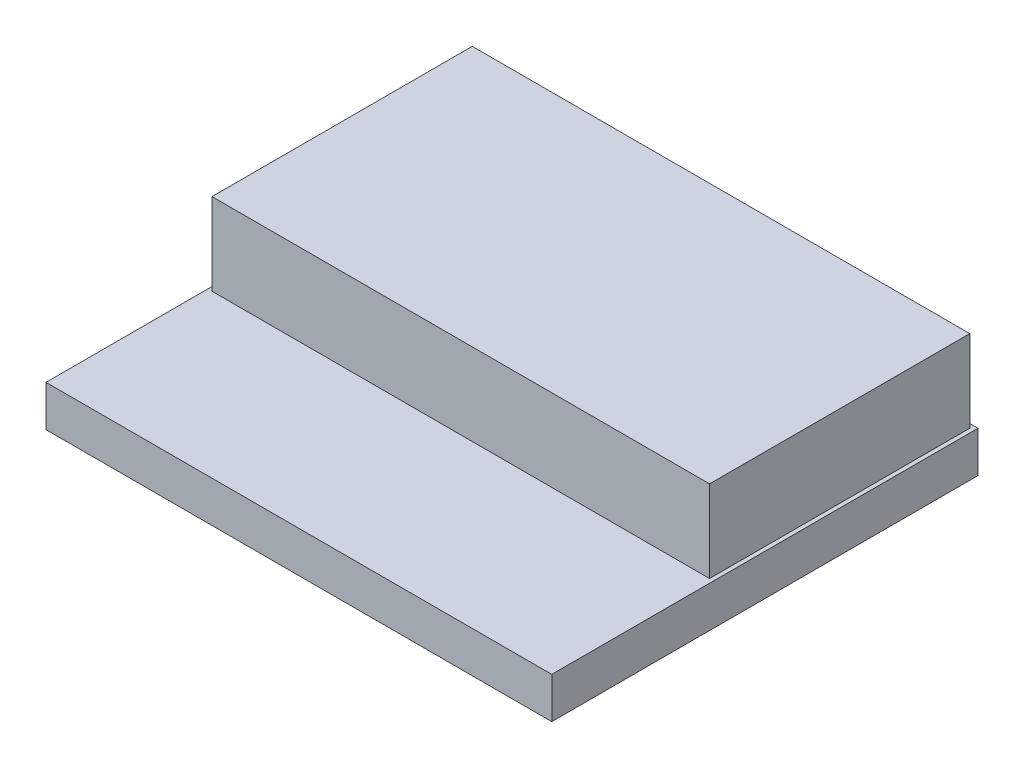
ISO-10303-21;
HEADER;
FILE_DESCRIPTION(('STEP AP214'),'2;1');
FILE_NAME('part.step','',(''),(''),'','','');
FILE_SCHEMA(('AUTOMOTIVE_DESIGN { 1 0 10303 214 1 1 1 1 }'));
ENDSEC;
DATA;
#1=APPLICATION_CONTEXT('core data for automotive mechanical design processes');
#2=APPLICATION_PROTOCOL_DEFINITION('international standard','automotive_design',2000,#1);
#3=PRODUCT_CONTEXT('',#1,'mechanical');
#4=PRODUCT('Part','Part','',(#3));
#5=PRODUCT_RELATED_PRODUCT_CATEGORY('part','',(#4));
#6=PRODUCT_DEFINITION_FORMATION('','',#4);
#7=PRODUCT_DEFINITION_CONTEXT('part definition',#1,'design');
#8=PRODUCT_DEFINITION('design','',#6,#7);
#9=PRODUCT_DEFINITION_SHAPE('','',#8);
#10=(LENGTH_UNIT() NAMED_UNIT(*) SI_UNIT(.MILLI.,.METRE.));
#11=(NAMED_UNIT(*) PLANE_ANGLE_UNIT() SI_UNIT($,.RADIAN.));
#12=(NAMED_UNIT(*) SI_UNIT($,.STERADIAN.) SOLID_ANGLE_UNIT());
#13=UNCERTAINTY_MEASURE_WITH_UNIT(LENGTH_MEASURE(1.E-05),#10,'distance_accuracy_value','');
#14=(GEOMETRIC_REPRESENTATION_CONTEXT(3) GLOBAL_UNCERTAINTY_ASSIGNED_CONTEXT((#13)) GLOBAL_UNIT_ASSIGNED_CONTEXT((#10,
#11,#12)) REPRESENTATION_CONTEXT('',''));
#15=CARTESIAN_POINT('',(0.,0.,0.));
#16=DIRECTION('',(0.,0.,1.));
#17=DIRECTION('',(1.,0.,0.));
#18=AXIS2_PLACEMENT_3D('',#15,#16,#17);
#19=CARTESIAN_POINT('',(0.,1.,0.));
#20=DIRECTION('',(0.,-1.,0.));
#21=DIRECTION('',(0.,0.,-1.));
#22=AXIS2_PLACEMENT_3D('',#19,#20,#21);
#23=PLANE('',#22);
#24=DIRECTION('',(0.,0.,-1.));
#25=VECTOR('',#24,1.);
#26=CARTESIAN_POINT('',(6.17,1.,5.2));
#27=LINE('',#26,#25);
#28=CARTESIAN_POINT('',(6.17,1.,5.2));
#29=VERTEX_POINT('',#28);
#30=CARTESIAN_POINT('',(6.17,1.,-5.2));
#31=VERTEX_POINT('',#30);
#32=EDGE_CURVE('E186',#29,#31,#27,.T.);
#33=ORIENTED_EDGE('',*,*,#32,.T.);
#34=DIRECTION('',(-1.,0.,0.));
#35=VECTOR('',#34,1.);
#36=CARTESIAN_POINT('',(-6.17,1.,-5.2));
#37=LINE('',#36,#35);
#38=CARTESIAN_POINT('',(-6.17,1.,-5.2));
#39=VERTEX_POINT('',#38);
#40=EDGE_CURVE('E189',#31,#39,#37,.T.);
#41=ORIENTED_EDGE('',*,*,#40,.T.);
#42=DIRECTION('',(0.,0.,1.));
#43=VECTOR('',#42,1.);
#44=CARTESIAN_POINT('',(-6.17,1.,5.2));
#45=LINE('',#44,#43);
#46=CARTESIAN_POINT('',(-6.17,1.,5.2));
#47=VERTEX_POINT('',#46);
#48=EDGE_CURVE('E192',#39,#47,#45,.T.);
#49=ORIENTED_EDGE('',*,*,#48,.T.);
#50=DIRECTION('',(1.,0.,0.));
#51=VECTOR('',#50,1.);
#52=CARTESIAN_POINT('',(-6.17,1.,5.2));
#53=LINE('',#52,#51);
#54=EDGE_CURVE('E194',#47,#29,#53,.T.);
#55=ORIENTED_EDGE('',*,*,#54,.T.);
#56=EDGE_LOOP('',(#33,#41,#49,#55));
#57=FACE_BOUND('',#56,.T.);
#58=DIRECTION('',(0.,0.,1.));
#59=VECTOR('',#58,1.);
#60=CARTESIAN_POINT('',(-6.07,1.,-5.1));
#61=LINE('',#60,#59);
#62=CARTESIAN_POINT('',(-6.07,1.,-5.1));
#63=VERTEX_POINT('',#62);
#64=CARTESIAN_POINT('',(-6.07,1.,1.25));
#65=VERTEX_POINT('',#64);
#66=EDGE_CURVE('E144',#63,#65,#61,.T.);
#67=ORIENTED_EDGE('',*,*,#66,.F.);
#68=DIRECTION('',(-1.,0.,0.));
#69=VECTOR('',#68,1.);
#70=CARTESIAN_POINT('',(6.07,1.,-5.1));
#71=LINE('',#70,#69);
#72=CARTESIAN_POINT('',(6.07,1.,-5.1));
#73=VERTEX_POINT('',#72);
#74=EDGE_CURVE('E169',#73,#63,#71,.T.);
#75=ORIENTED_EDGE('',*,*,#74,.F.);
#76=DIRECTION('',(0.,0.,-1.));
#77=VECTOR('',#76,1.);
#78=CARTESIAN_POINT('',(6.07,1.,1.25));
#79=LINE('',#78,#77);
#80=CARTESIAN_POINT('',(6.07,1.,1.25));
#81=VERTEX_POINT('',#80);
#82=EDGE_CURVE('E166',#81,#73,#79,.T.);
#83=ORIENTED_EDGE('',*,*,#82,.F.);
#84=DIRECTION('',(1.,0.,0.));
#85=VECTOR('',#84,1.);
#86=CARTESIAN_POINT('',(-6.07,1.,1.25));
#87=LINE('',#86,#85);
#88=EDGE_CURVE('E147',#65,#81,#87,.T.);
#89=ORIENTED_EDGE('',*,*,#88,.F.);
#90=EDGE_LOOP('',(#67,#75,#83,#89));
#91=FACE_BOUND('',#90,.T.);
#92=ADVANCED_FACE('F35',(#57,#91),#23,.F.);
#93=CARTESIAN_POINT('',(6.17,1.,5.2));
#94=DIRECTION('',(-1.,0.,0.));
#95=DIRECTION('',(0.,0.,1.));
#96=AXIS2_PLACEMENT_3D('',#93,#94,#95);
#97=PLANE('',#96);
#98=DIRECTION('',(0.,0.,-1.));
#99=VECTOR('',#98,1.);
#100=CARTESIAN_POINT('',(6.17,0.,5.2));
#101=LINE('',#100,#99);
#102=CARTESIAN_POINT('',(6.17,0.,5.2));
#103=VERTEX_POINT('',#102);
#104=CARTESIAN_POINT('',(6.17,0.,-5.2));
#105=VERTEX_POINT('',#104);
#106=EDGE_CURVE('E162',#103,#105,#101,.T.);
#107=ORIENTED_EDGE('',*,*,#106,.T.);
#108=DIRECTION('',(0.,-1.,0.));
#109=VECTOR('',#108,1.);
#110=CARTESIAN_POINT('',(6.17,1.,-5.2));
#111=LINE('',#110,#109);
#112=EDGE_CURVE('E12',#31,#105,#111,.T.);
#113=ORIENTED_EDGE('',*,*,#112,.F.);
#114=ORIENTED_EDGE('',*,*,#32,.F.);
#115=DIRECTION('',(0.,-1.,0.));
#116=VECTOR('',#115,1.);
#117=CARTESIAN_POINT('',(6.17,1.,5.2));
#118=LINE('',#117,#116);
#119=EDGE_CURVE('E196',#29,#103,#118,.T.);
#120=ORIENTED_EDGE('',*,*,#119,.T.);
#121=EDGE_LOOP('',(#107,#113,#114,#120));
#122=FACE_BOUND('',#121,.T.);
#123=ADVANCED_FACE('F37',(#122),#97,.F.);
#124=CARTESIAN_POINT('',(-6.17,1.,-5.2));
#125=DIRECTION('',(0.,0.,1.));
#126=DIRECTION('',(1.,0.,0.));
#127=AXIS2_PLACEMENT_3D('',#124,#125,#126);
#128=PLANE('',#127);
#129=DIRECTION('',(-1.,0.,0.));
#130=VECTOR('',#129,1.);
#131=CARTESIAN_POINT('',(-6.17,0.,-5.2));
#132=LINE('',#131,#130);
#133=CARTESIAN_POINT('',(-6.17,0.,-5.2));
#134=VERTEX_POINT('',#133);
#135=EDGE_CURVE('E199',#105,#134,#132,.T.);
#136=ORIENTED_EDGE('',*,*,#135,.T.);
#137=DIRECTION('',(0.,-1.,0.));
#138=VECTOR('',#137,1.);
#139=CARTESIAN_POINT('',(-6.17,1.,-5.2));
#140=LINE('',#139,#138);
#141=EDGE_CURVE('E43',#39,#134,#140,.T.);
#142=ORIENTED_EDGE('',*,*,#141,.F.);
#143=ORIENTED_EDGE('',*,*,#40,.F.);
#144=ORIENTED_EDGE('',*,*,#112,.T.);
#145=EDGE_LOOP('',(#136,#142,#143,#144));
#146=FACE_BOUND('',#145,.T.);
#147=ADVANCED_FACE('F229',(#146),#128,.F.);
#148=CARTESIAN_POINT('',(-6.17,1.,5.2));
#149=DIRECTION('',(1.,0.,0.));
#150=DIRECTION('',(0.,0.,-1.));
#151=AXIS2_PLACEMENT_3D('',#148,#149,#150);
#152=PLANE('',#151);
#153=DIRECTION('',(0.,0.,1.));
#154=VECTOR('',#153,1.);
#155=CARTESIAN_POINT('',(-6.17,0.,5.2));
#156=LINE('',#155,#154);
#157=CARTESIAN_POINT('',(-6.17,0.,5.2));
#158=VERTEX_POINT('',#157);
#159=EDGE_CURVE('E201',#134,#158,#156,.T.);
#160=ORIENTED_EDGE('',*,*,#159,.T.);
#161=DIRECTION('',(0.,-1.,0.));
#162=VECTOR('',#161,1.);
#163=CARTESIAN_POINT('',(-6.17,1.,5.2));
#164=LINE('',#163,#162);
#165=EDGE_CURVE('E206',#47,#158,#164,.T.);
#166=ORIENTED_EDGE('',*,*,#165,.F.);
#167=ORIENTED_EDGE('',*,*,#48,.F.);
#168=ORIENTED_EDGE('',*,*,#141,.T.);
#169=EDGE_LOOP('',(#160,#166,#167,#168));
#170=FACE_BOUND('',#169,.T.);
#171=ADVANCED_FACE('F213',(#170),#152,.F.);
#172=CARTESIAN_POINT('',(-6.17,1.,5.2));
#173=DIRECTION('',(0.,0.,-1.));
#174=DIRECTION('',(-1.,0.,0.));
#175=AXIS2_PLACEMENT_3D('',#172,#173,#174);
#176=PLANE('',#175);
#177=DIRECTION('',(1.,0.,0.));
#178=VECTOR('',#177,1.);
#179=CARTESIAN_POINT('',(-6.17,0.,5.2));
#180=LINE('',#179,#178);
#181=EDGE_CURVE('E190',#158,#103,#180,.T.);
#182=ORIENTED_EDGE('',*,*,#181,.T.);
#183=ORIENTED_EDGE('',*,*,#119,.F.);
#184=ORIENTED_EDGE('',*,*,#54,.F.);
#185=ORIENTED_EDGE('',*,*,#165,.T.);
#186=EDGE_LOOP('',(#182,#183,#184,#185));
#187=FACE_BOUND('',#186,.T.);
#188=ADVANCED_FACE('F222',(#187),#176,.F.);
#189=CARTESIAN_POINT('',(0.,0.,0.));
#190=DIRECTION('',(0.,-1.,0.));
#191=DIRECTION('',(0.,0.,-1.));
#192=AXIS2_PLACEMENT_3D('',#189,#190,#191);
#193=PLANE('',#192);
#194=DIRECTION('',(1.,0.,0.));
#195=VECTOR('',#194,1.);
#196=CARTESIAN_POINT('',(-2.3,0.,-1.33));
#197=LINE('',#196,#195);
#198=CARTESIAN_POINT('',(-2.3,0.,-1.33));
#199=VERTEX_POINT('',#198);
#200=CARTESIAN_POINT('',(2.3,0.,-1.33));
#201=VERTEX_POINT('',#200);
#202=EDGE_CURVE('E50',#199,#201,#197,.T.);
#203=ORIENTED_EDGE('',*,*,#202,.F.);
#204=DIRECTION('',(0.,0.,-1.));
#205=VECTOR('',#204,1.);
#206=CARTESIAN_POINT('',(-2.3,0.,1.33));
#207=LINE('',#206,#205);
#208=CARTESIAN_POINT('',(-2.3,0.,1.33));
#209=VERTEX_POINT('',#208);
#210=EDGE_CURVE('E54',#209,#199,#207,.T.);
#211=ORIENTED_EDGE('',*,*,#210,.F.);
#212=DIRECTION('',(-1.,0.,0.));
#213=VECTOR('',#212,1.);
#214=CARTESIAN_POINT('',(2.3,0.,1.33));
#215=LINE('',#214,#213);
#216=CARTESIAN_POINT('',(2.3,0.,1.33));
#217=VERTEX_POINT('',#216);
#218=EDGE_CURVE('E373',#217,#209,#215,.T.);
#219=ORIENTED_EDGE('',*,*,#218,.F.);
#220=DIRECTION('',(0.,0.,1.));
#221=VECTOR('',#220,1.);
#222=CARTESIAN_POINT('',(2.3,0.,-1.33));
#223=LINE('',#222,#221);
#224=EDGE_CURVE('E379',#201,#217,#223,.T.);
#225=ORIENTED_EDGE('',*,*,#224,.F.);
#226=EDGE_LOOP('',(#203,#211,#219,#225));
#227=FACE_BOUND('',#226,.T.);
#228=ORIENTED_EDGE('',*,*,#106,.F.);
#229=ORIENTED_EDGE('',*,*,#181,.F.);
#230=ORIENTED_EDGE('',*,*,#159,.F.);
#231=ORIENTED_EDGE('',*,*,#135,.F.);
#232=EDGE_LOOP('',(#228,#229,#230,#231));
#233=FACE_BOUND('',#232,.T.);
#234=ADVANCED_FACE('F219',(#227,#233),#193,.T.);
#235=CARTESIAN_POINT('',(6.07,19.7004415987223,-5.1));
#236=DIRECTION('',(0.,0.,1.));
#237=DIRECTION('',(1.,0.,0.));
#238=AXIS2_PLACEMENT_3D('',#235,#236,#237);
#239=PLANE('',#238);
#240=DIRECTION('',(0.,-1.,0.));
#241=VECTOR('',#240,1.);
#242=CARTESIAN_POINT('',(-6.07,19.7004415987223,-5.1));
#243=LINE('',#242,#241);
#244=CARTESIAN_POINT('',(-6.07,3.,-5.1));
#245=VERTEX_POINT('',#244);
#246=EDGE_CURVE('E172',#245,#63,#243,.T.);
#247=ORIENTED_EDGE('',*,*,#246,.F.);
#248=DIRECTION('',(1.,0.,0.));
#249=VECTOR('',#248,1.);
#250=CARTESIAN_POINT('',(6.07,3.,-5.1));
#251=LINE('',#250,#249);
#252=CARTESIAN_POINT('',(6.07,3.,-5.1));
#253=VERTEX_POINT('',#252);
#254=EDGE_CURVE('E157',#245,#253,#251,.T.);
#255=ORIENTED_EDGE('',*,*,#254,.T.);
#256=DIRECTION('',(0.,-1.,0.));
#257=VECTOR('',#256,1.);
#258=CARTESIAN_POINT('',(6.07,19.7004415987223,-5.1));
#259=LINE('',#258,#257);
#260=EDGE_CURVE('E175',#253,#73,#259,.T.);
#261=ORIENTED_EDGE('',*,*,#260,.T.);
#262=ORIENTED_EDGE('',*,*,#74,.T.);
#263=EDGE_LOOP('',(#247,#255,#261,#262));
#264=FACE_BOUND('',#263,.T.);
#265=ADVANCED_FACE('F246',(#264),#239,.F.);
#266=CARTESIAN_POINT('',(6.07,19.7004415987223,1.25));
#267=DIRECTION('',(-1.,0.,0.));
#268=DIRECTION('',(0.,0.,1.));
#269=AXIS2_PLACEMENT_3D('',#266,#267,#268);
#270=PLANE('',#269);
#271=ORIENTED_EDGE('',*,*,#260,.F.);
#272=DIRECTION('',(0.,0.,1.));
#273=VECTOR('',#272,1.);
#274=CARTESIAN_POINT('',(6.07,3.,1.25));
#275=LINE('',#274,#273);
#276=CARTESIAN_POINT('',(6.07,3.,1.25));
#277=VERTEX_POINT('',#276);
#278=EDGE_CURVE('E153',#253,#277,#275,.T.);
#279=ORIENTED_EDGE('',*,*,#278,.T.);
#280=DIRECTION('',(0.,-1.,0.));
#281=VECTOR('',#280,1.);
#282=CARTESIAN_POINT('',(6.07,19.7004415987223,1.25));
#283=LINE('',#282,#281);
#284=EDGE_CURVE('E178',#277,#81,#283,.T.);
#285=ORIENTED_EDGE('',*,*,#284,.T.);
#286=ORIENTED_EDGE('',*,*,#82,.T.);
#287=EDGE_LOOP('',(#271,#279,#285,#286));
#288=FACE_BOUND('',#287,.T.);
#289=ADVANCED_FACE('F264',(#288),#270,.F.);
#290=CARTESIAN_POINT('',(-6.07,19.7004415987223,1.25));
#291=DIRECTION('',(0.,0.,-1.));
#292=DIRECTION('',(-1.,0.,0.));
#293=AXIS2_PLACEMENT_3D('',#290,#291,#292);
#294=PLANE('',#293);
#295=ORIENTED_EDGE('',*,*,#284,.F.);
#296=DIRECTION('',(-1.,0.,0.));
#297=VECTOR('',#296,1.);
#298=CARTESIAN_POINT('',(-6.07,3.,1.25));
#299=LINE('',#298,#297);
#300=CARTESIAN_POINT('',(-6.07,3.,1.25));
#301=VERTEX_POINT('',#300);
#302=EDGE_CURVE('E156',#277,#301,#299,.T.);
#303=ORIENTED_EDGE('',*,*,#302,.T.);
#304=DIRECTION('',(0.,-1.,0.));
#305=VECTOR('',#304,1.);
#306=CARTESIAN_POINT('',(-6.07,19.7004415987223,1.25));
#307=LINE('',#306,#305);
#308=EDGE_CURVE('E181',#301,#65,#307,.T.);
#309=ORIENTED_EDGE('',*,*,#308,.T.);
#310=ORIENTED_EDGE('',*,*,#88,.T.);
#311=EDGE_LOOP('',(#295,#303,#309,#310));
#312=FACE_BOUND('',#311,.T.);
#313=ADVANCED_FACE('F272',(#312),#294,.F.);
#314=CARTESIAN_POINT('',(-6.07,19.7004415987223,-5.1));
#315=DIRECTION('',(1.,0.,0.));
#316=DIRECTION('',(0.,0.,-1.));
#317=AXIS2_PLACEMENT_3D('',#314,#315,#316);
#318=PLANE('',#317);
#319=ORIENTED_EDGE('',*,*,#308,.F.);
#320=DIRECTION('',(0.,0.,-1.));
#321=VECTOR('',#320,1.);
#322=CARTESIAN_POINT('',(-6.07,3.,-5.1));
#323=LINE('',#322,#321);
#324=EDGE_CURVE('E160',#301,#245,#323,.T.);
#325=ORIENTED_EDGE('',*,*,#324,.T.);
#326=ORIENTED_EDGE('',*,*,#246,.T.);
#327=ORIENTED_EDGE('',*,*,#66,.T.);
#328=EDGE_LOOP('',(#319,#325,#326,#327));
#329=FACE_BOUND('',#328,.T.);
#330=ADVANCED_FACE('F242',(#329),#318,.F.);
#331=CARTESIAN_POINT('',(0.,3.,0.));
#332=DIRECTION('',(0.,-1.,0.));
#333=DIRECTION('',(0.,0.,-1.));
#334=AXIS2_PLACEMENT_3D('',#331,#332,#333);
#335=PLANE('',#334);
#336=ORIENTED_EDGE('',*,*,#302,.F.);
#337=ORIENTED_EDGE('',*,*,#278,.F.);
#338=ORIENTED_EDGE('',*,*,#254,.F.);
#339=ORIENTED_EDGE('',*,*,#324,.F.);
#340=EDGE_LOOP('',(#336,#337,#338,#339));
#341=FACE_BOUND('',#340,.T.);
#342=ADVANCED_FACE('F286',(#341),#335,.F.);
#343=CARTESIAN_POINT('',(-2.3,-1.,-1.33));
#344=DIRECTION('',(0.,0.,1.));
#345=DIRECTION('',(1.,0.,0.));
#346=AXIS2_PLACEMENT_3D('',#343,#344,#345);
#347=PLANE('',#346);
#348=ORIENTED_EDGE('',*,*,#202,.T.);
#349=DIRECTION('',(0.,1.,0.));
#350=VECTOR('',#349,1.);
#351=CARTESIAN_POINT('',(2.3,-1.,-1.33));
#352=LINE('',#351,#350);
#353=CARTESIAN_POINT('',(2.3,-1.,-1.33));
#354=VERTEX_POINT('',#353);
#355=EDGE_CURVE('E127',#354,#201,#352,.T.);
#356=ORIENTED_EDGE('',*,*,#355,.F.);
#357=DIRECTION('',(1.,0.,0.));
#358=VECTOR('',#357,1.);
#359=CARTESIAN_POINT('',(-2.3,-1.,-1.33));
#360=LINE('',#359,#358);
#361=CARTESIAN_POINT('',(-2.3,-1.,-1.33));
#362=VERTEX_POINT('',#361);
#363=EDGE_CURVE('E133',#362,#354,#360,.T.);
#364=ORIENTED_EDGE('',*,*,#363,.F.);
#365=DIRECTION('',(0.,1.,0.));
#366=VECTOR('',#365,1.);
#367=CARTESIAN_POINT('',(-2.3,-1.,-1.33));
#368=LINE('',#367,#366);
#369=EDGE_CURVE('E371',#362,#199,#368,.T.);
#370=ORIENTED_EDGE('',*,*,#369,.T.);
#371=EDGE_LOOP('',(#348,#356,#364,#370));
#372=FACE_BOUND('',#371,.T.);
#373=ADVANCED_FACE('F143',(#372),#347,.F.);
#374=CARTESIAN_POINT('',(2.3,-1.,-1.33));
#375=DIRECTION('',(-1.,0.,0.));
#376=DIRECTION('',(0.,0.,1.));
#377=AXIS2_PLACEMENT_3D('',#374,#375,#376);
#378=PLANE('',#377);
#379=ORIENTED_EDGE('',*,*,#224,.T.);
#380=DIRECTION('',(0.,1.,0.));
#381=VECTOR('',#380,1.);
#382=CARTESIAN_POINT('',(2.3,-1.,1.33));
#383=LINE('',#382,#381);
#384=CARTESIAN_POINT('',(2.3,-1.,1.33));
#385=VERTEX_POINT('',#384);
#386=EDGE_CURVE('E129',#385,#217,#383,.T.);
#387=ORIENTED_EDGE('',*,*,#386,.F.);
#388=DIRECTION('',(0.,0.,1.));
#389=VECTOR('',#388,1.);
#390=CARTESIAN_POINT('',(2.3,-1.,-1.33));
#391=LINE('',#390,#389);
#392=EDGE_CURVE('E122',#354,#385,#391,.T.);
#393=ORIENTED_EDGE('',*,*,#392,.F.);
#394=ORIENTED_EDGE('',*,*,#355,.T.);
#395=EDGE_LOOP('',(#379,#387,#393,#394));
#396=FACE_BOUND('',#395,.T.);
#397=ADVANCED_FACE('F125',(#396),#378,.F.);
#398=CARTESIAN_POINT('',(2.3,-1.,1.33));
#399=DIRECTION('',(0.,0.,-1.));
#400=DIRECTION('',(-1.,0.,0.));
#401=AXIS2_PLACEMENT_3D('',#398,#399,#400);
#402=PLANE('',#401);
#403=ORIENTED_EDGE('',*,*,#218,.T.);
#404=DIRECTION('',(0.,1.,0.));
#405=VECTOR('',#404,1.);
#406=CARTESIAN_POINT('',(-2.3,-1.,1.33));
#407=LINE('',#406,#405);
#408=CARTESIAN_POINT('',(-2.3,-1.,1.33));
#409=VERTEX_POINT('',#408);
#410=EDGE_CURVE('E149',#409,#209,#407,.T.);
#411=ORIENTED_EDGE('',*,*,#410,.F.);
#412=DIRECTION('',(-1.,0.,0.));
#413=VECTOR('',#412,1.);
#414=CARTESIAN_POINT('',(2.3,-1.,1.33));
#415=LINE('',#414,#413);
#416=EDGE_CURVE('E132',#385,#409,#415,.T.);
#417=ORIENTED_EDGE('',*,*,#416,.F.);
#418=ORIENTED_EDGE('',*,*,#386,.T.);
#419=EDGE_LOOP('',(#403,#411,#417,#418));
#420=FACE_BOUND('',#419,.T.);
#421=ADVANCED_FACE('F304',(#420),#402,.F.);
#422=CARTESIAN_POINT('',(-2.3,-1.,1.33));
#423=DIRECTION('',(1.,0.,0.));
#424=DIRECTION('',(0.,0.,-1.));
#425=AXIS2_PLACEMENT_3D('',#422,#423,#424);
#426=PLANE('',#425);
#427=ORIENTED_EDGE('',*,*,#210,.T.);
#428=ORIENTED_EDGE('',*,*,#369,.F.);
#429=DIRECTION('',(0.,0.,-1.));
#430=VECTOR('',#429,1.);
#431=CARTESIAN_POINT('',(-2.3,-1.,1.33));
#432=LINE('',#431,#430);
#433=EDGE_CURVE('E138',#409,#362,#432,.T.);
#434=ORIENTED_EDGE('',*,*,#433,.F.);
#435=ORIENTED_EDGE('',*,*,#410,.T.);
#436=EDGE_LOOP('',(#427,#428,#434,#435));
#437=FACE_BOUND('',#436,.T.);
#438=ADVANCED_FACE('F311',(#437),#426,.F.);
#439=CARTESIAN_POINT('',(0.,-1.,0.));
#440=DIRECTION('',(0.,-1.,0.));
#441=DIRECTION('',(0.,0.,-1.));
#442=AXIS2_PLACEMENT_3D('',#439,#440,#441);
#443=PLANE('',#442);
#444=ORIENTED_EDGE('',*,*,#363,.T.);
#445=ORIENTED_EDGE('',*,*,#392,.T.);
#446=ORIENTED_EDGE('',*,*,#416,.T.);
#447=ORIENTED_EDGE('',*,*,#433,.T.);
#448=EDGE_LOOP('',(#444,#445,#446,#447));
#449=FACE_BOUND('',#448,.T.);
#450=ADVANCED_FACE('F136',(#449),#443,.T.);
#451=CLOSED_SHELL('',(#92,#123,#147,#171,#188,#234,#265,#289,#313,#330,#342,#373,#397,#421,#438,#450));
#452=MANIFOLD_SOLID_BREP('B2',#451);
#453=ADVANCED_BREP_SHAPE_REPRESENTATION('',(#18,#452),#14);
#454=SHAPE_DEFINITION_REPRESENTATION(#9,#453);
ENDSEC;
END-ISO-10303-21;
